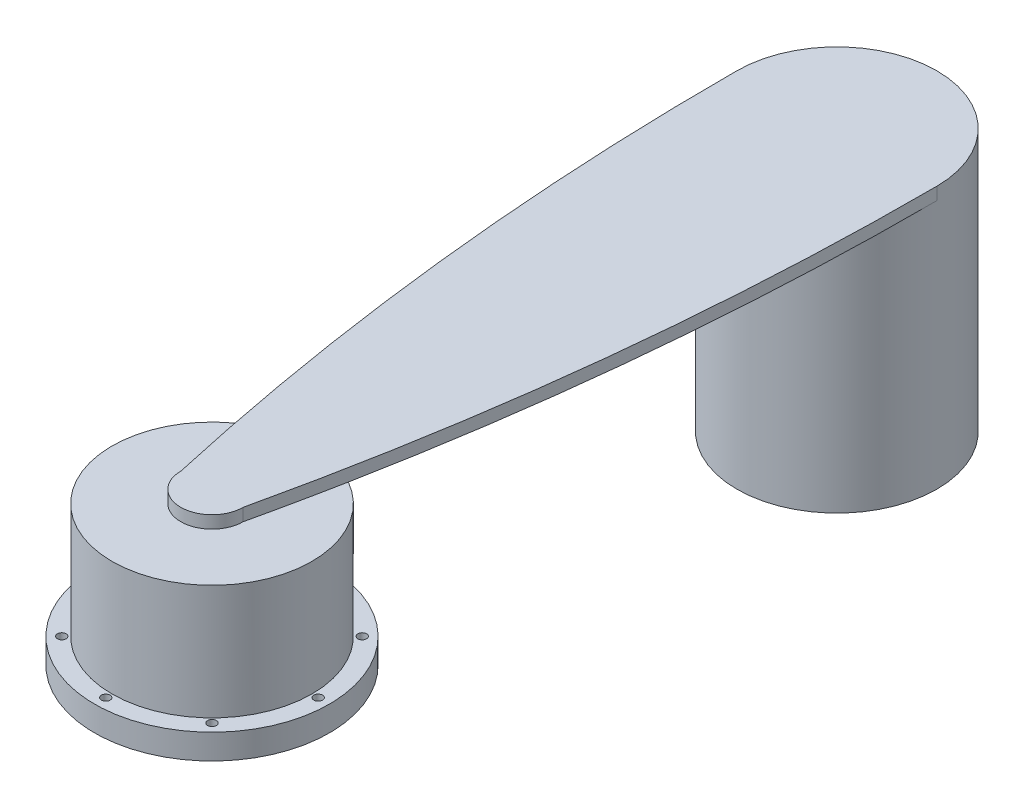
ISO-10303-21;
HEADER;
FILE_DESCRIPTION(('STEP AP214'),'2;1');
FILE_NAME('part.step','',(''),(''),'','','');
FILE_SCHEMA(('AUTOMOTIVE_DESIGN { 1 0 10303 214 1 1 1 1 }'));
ENDSEC;
DATA;
#1=APPLICATION_CONTEXT('core data for automotive mechanical design processes');
#2=APPLICATION_PROTOCOL_DEFINITION('international standard','automotive_design',2000,#1);
#3=PRODUCT_CONTEXT('',#1,'mechanical');
#4=PRODUCT('Part','Part','',(#3));
#5=PRODUCT_RELATED_PRODUCT_CATEGORY('part','',(#4));
#6=PRODUCT_DEFINITION_FORMATION('','',#4);
#7=PRODUCT_DEFINITION_CONTEXT('part definition',#1,'design');
#8=PRODUCT_DEFINITION('design','',#6,#7);
#9=PRODUCT_DEFINITION_SHAPE('','',#8);
#10=(LENGTH_UNIT() NAMED_UNIT(*) SI_UNIT(.MILLI.,.METRE.));
#11=(NAMED_UNIT(*) PLANE_ANGLE_UNIT() SI_UNIT($,.RADIAN.));
#12=(NAMED_UNIT(*) SI_UNIT($,.STERADIAN.) SOLID_ANGLE_UNIT());
#13=UNCERTAINTY_MEASURE_WITH_UNIT(LENGTH_MEASURE(1.E-05),#10,'distance_accuracy_value','');
#14=(GEOMETRIC_REPRESENTATION_CONTEXT(3) GLOBAL_UNCERTAINTY_ASSIGNED_CONTEXT((#13)) GLOBAL_UNIT_ASSIGNED_CONTEXT((#10,
#11,#12)) REPRESENTATION_CONTEXT('',''));
#15=CARTESIAN_POINT('',(0.,0.,0.));
#16=DIRECTION('',(0.,0.,1.));
#17=DIRECTION('',(1.,0.,0.));
#18=AXIS2_PLACEMENT_3D('',#15,#16,#17);
#19=CARTESIAN_POINT('',(0.,55.,-250.));
#20=DIRECTION('',(0.,-1.,0.));
#21=DIRECTION('',(0.,0.,-1.));
#22=AXIS2_PLACEMENT_3D('',#19,#20,#21);
#23=CYLINDRICAL_SURFACE('',#22,40.);
#24=CARTESIAN_POINT('',(0.,50.,-250.));
#25=DIRECTION('',(0.,1.,0.));
#26=DIRECTION('',(0.,0.,1.));
#27=AXIS2_PLACEMENT_3D('',#24,#25,#26);
#28=CIRCLE('',#27,40.);
#29=CARTESIAN_POINT('',(-40.,50.,-250.));
#30=VERTEX_POINT('',#29);
#31=CARTESIAN_POINT('',(40.,50.,-249.997784619593));
#32=VERTEX_POINT('',#31);
#33=EDGE_CURVE('E12',#30,#32,#28,.T.);
#34=ORIENTED_EDGE('',*,*,#33,.F.);
#35=DIRECTION('',(0.,1.,0.));
#36=VECTOR('',#35,1.);
#37=CARTESIAN_POINT('',(-40.0000000613489,50.,-250.));
#38=LINE('',#37,#36);
#39=CARTESIAN_POINT('',(-40.0000000613489,55.,-250.));
#40=VERTEX_POINT('',#39);
#41=EDGE_CURVE('E145',#30,#40,#38,.T.);
#42=ORIENTED_EDGE('',*,*,#41,.T.);
#43=CARTESIAN_POINT('',(0.,55.,-250.));
#44=DIRECTION('',(0.,1.,0.));
#45=DIRECTION('',(0.,0.,1.));
#46=AXIS2_PLACEMENT_3D('',#43,#44,#45);
#47=CIRCLE('',#46,40.0000000613489);
#48=CARTESIAN_POINT('',(40.0000000613489,55.,-250.));
#49=VERTEX_POINT('',#48);
#50=EDGE_CURVE('E142',#49,#40,#47,.T.);
#51=ORIENTED_EDGE('',*,*,#50,.F.);
#52=DIRECTION('',(0.,1.,0.));
#53=VECTOR('',#52,1.);
#54=CARTESIAN_POINT('',(40.0000000613489,50.,-250.));
#55=LINE('',#54,#53);
#56=CARTESIAN_POINT('',(40.0000000613489,50.,-250.));
#57=VERTEX_POINT('',#56);
#58=EDGE_CURVE('E147',#57,#49,#55,.T.);
#59=ORIENTED_EDGE('',*,*,#58,.F.);
#60=DIRECTION('',(0.,0.,-1.));
#61=VECTOR('',#60,1.);
#62=CARTESIAN_POINT('',(40.,50.,0.));
#63=LINE('',#62,#61);
#64=EDGE_CURVE('E58',#32,#57,#63,.T.);
#65=ORIENTED_EDGE('',*,*,#64,.F.);
#66=EDGE_LOOP('',(#34,#42,#51,#59,#65));
#67=FACE_BOUND('',#66,.T.);
#68=CARTESIAN_POINT('',(0.,-50.,-250.));
#69=DIRECTION('',(0.,-1.,0.));
#70=DIRECTION('',(0.,0.,-1.));
#71=AXIS2_PLACEMENT_3D('',#68,#69,#70);
#72=CIRCLE('',#71,39.9999999693256);
#73=CARTESIAN_POINT('',(0.,-50.,-289.999999969326));
#74=VERTEX_POINT('',#73);
#75=EDGE_CURVE('E119',#74,#74,#72,.T.);
#76=ORIENTED_EDGE('',*,*,#75,.F.);
#77=EDGE_LOOP('',(#76));
#78=FACE_BOUND('',#77,.T.);
#79=ADVANCED_FACE('F51',(#67,#78),#23,.T.);
#80=CARTESIAN_POINT('',(1080.43486466352,50.,-246.735335387937));
#81=DIRECTION('',(0.,1.,0.));
#82=DIRECTION('',(0.,0.,1.));
#83=AXIS2_PLACEMENT_3D('',#80,#81,#82);
#84=CYLINDRICAL_SURFACE('',#83,1120.43962091942);
#85=CARTESIAN_POINT('',(1080.43486466352,55.,-246.735335387937));
#86=DIRECTION('',(0.,1.,0.));
#87=DIRECTION('',(0.,0.,1.));
#88=AXIS2_PLACEMENT_3D('',#85,#86,#87);
#89=CIRCLE('',#88,1120.43962091942);
#90=CARTESIAN_POINT('',(-12.5,55.,0.));
#91=VERTEX_POINT('',#90);
#92=EDGE_CURVE('E132',#40,#91,#89,.T.);
#93=ORIENTED_EDGE('',*,*,#92,.F.);
#94=ORIENTED_EDGE('',*,*,#41,.F.);
#95=CARTESIAN_POINT('',(1080.43486466352,50.,-246.735335387937));
#96=DIRECTION('',(0.,1.,0.));
#97=DIRECTION('',(0.,0.,1.));
#98=AXIS2_PLACEMENT_3D('',#95,#96,#97);
#99=CIRCLE('',#98,1120.43962091942);
#100=CARTESIAN_POINT('',(-19.7724904494712,50.,-34.7713764672247));
#101=VERTEX_POINT('',#100);
#102=EDGE_CURVE('E129',#30,#101,#99,.T.);
#103=ORIENTED_EDGE('',*,*,#102,.T.);
#104=CARTESIAN_POINT('',(-12.5,50.,0.));
#105=VERTEX_POINT('',#104);
#106=EDGE_CURVE('E117',#101,#105,#99,.T.);
#107=ORIENTED_EDGE('',*,*,#106,.T.);
#108=DIRECTION('',(0.,1.,0.));
#109=VECTOR('',#108,1.);
#110=CARTESIAN_POINT('',(-12.5,50.,0.));
#111=LINE('',#110,#109);
#112=EDGE_CURVE('E109',#105,#91,#111,.T.);
#113=ORIENTED_EDGE('',*,*,#112,.T.);
#114=EDGE_LOOP('',(#93,#94,#103,#107,#113));
#115=FACE_BOUND('',#114,.T.);
#116=ADVANCED_FACE('F161',(#115),#84,.T.);
#117=CARTESIAN_POINT('',(-1080.43486466352,50.,-246.735335387937));
#118=DIRECTION('',(0.,1.,0.));
#119=DIRECTION('',(0.,0.,1.));
#120=AXIS2_PLACEMENT_3D('',#117,#118,#119);
#121=CYLINDRICAL_SURFACE('',#120,1120.43962091942);
#122=CARTESIAN_POINT('',(-1080.43486466352,55.,-246.735335387937));
#123=DIRECTION('',(0.,1.,0.));
#124=DIRECTION('',(0.,0.,-1.));
#125=AXIS2_PLACEMENT_3D('',#122,#123,#124);
#126=CIRCLE('',#125,1120.43962091942);
#127=CARTESIAN_POINT('',(12.5,55.,1.38777878078145E-13));
#128=VERTEX_POINT('',#127);
#129=EDGE_CURVE('E139',#128,#49,#126,.T.);
#130=ORIENTED_EDGE('',*,*,#129,.F.);
#131=DIRECTION('',(0.,1.,0.));
#132=VECTOR('',#131,1.);
#133=CARTESIAN_POINT('',(12.5,50.,1.38777878078145E-13));
#134=LINE('',#133,#132);
#135=CARTESIAN_POINT('',(12.5,50.,1.38777878078145E-13));
#136=VERTEX_POINT('',#135);
#137=EDGE_CURVE('E104',#136,#128,#134,.T.);
#138=ORIENTED_EDGE('',*,*,#137,.F.);
#139=CARTESIAN_POINT('',(-1080.43486466352,50.,-246.735335387937));
#140=DIRECTION('',(0.,1.,0.));
#141=DIRECTION('',(0.,0.,-1.));
#142=AXIS2_PLACEMENT_3D('',#139,#140,#141);
#143=CIRCLE('',#142,1120.43962091942);
#144=CARTESIAN_POINT('',(19.7724904494718,50.,-34.7713764672258));
#145=VERTEX_POINT('',#144);
#146=EDGE_CURVE('E100',#136,#145,#143,.T.);
#147=ORIENTED_EDGE('',*,*,#146,.T.);
#148=EDGE_CURVE('E103',#145,#32,#143,.T.);
#149=ORIENTED_EDGE('',*,*,#148,.T.);
#150=ORIENTED_EDGE('',*,*,#64,.T.);
#151=ORIENTED_EDGE('',*,*,#58,.T.);
#152=EDGE_LOOP('',(#130,#138,#147,#149,#150,#151));
#153=FACE_BOUND('',#152,.T.);
#154=ADVANCED_FACE('F102',(#153),#121,.T.);
#155=CARTESIAN_POINT('',(0.,50.,0.));
#156=DIRECTION('',(0.,1.,0.));
#157=DIRECTION('',(0.,0.,1.));
#158=AXIS2_PLACEMENT_3D('',#155,#156,#157);
#159=CYLINDRICAL_SURFACE('',#158,12.5);
#160=CARTESIAN_POINT('',(0.,55.,0.));
#161=DIRECTION('',(0.,1.,0.));
#162=DIRECTION('',(0.,0.,1.));
#163=AXIS2_PLACEMENT_3D('',#160,#161,#162);
#164=CIRCLE('',#163,12.5);
#165=EDGE_CURVE('E135',#91,#128,#164,.T.);
#166=ORIENTED_EDGE('',*,*,#165,.F.);
#167=ORIENTED_EDGE('',*,*,#112,.F.);
#168=CARTESIAN_POINT('',(0.,50.,0.));
#169=DIRECTION('',(0.,1.,0.));
#170=DIRECTION('',(0.,0.,1.));
#171=AXIS2_PLACEMENT_3D('',#168,#169,#170);
#172=CIRCLE('',#171,12.5);
#173=EDGE_CURVE('E112',#105,#136,#172,.T.);
#174=ORIENTED_EDGE('',*,*,#173,.T.);
#175=ORIENTED_EDGE('',*,*,#137,.T.);
#176=EDGE_LOOP('',(#166,#167,#174,#175));
#177=FACE_BOUND('',#176,.T.);
#178=ADVANCED_FACE('F159',(#177),#159,.T.);
#179=CARTESIAN_POINT('',(540.217432331759,50.,-123.367667693968));
#180=DIRECTION('',(0.,1.,0.));
#181=DIRECTION('',(0.,0.,1.));
#182=AXIS2_PLACEMENT_3D('',#179,#180,#181);
#183=PLANE('',#182);
#184=CARTESIAN_POINT('',(0.,50.,0.));
#185=DIRECTION('',(0.,1.,0.));
#186=DIRECTION('',(0.,0.,1.));
#187=AXIS2_PLACEMENT_3D('',#184,#185,#186);
#188=CIRCLE('',#187,40.);
#189=EDGE_CURVE('E65',#145,#101,#188,.T.);
#190=ORIENTED_EDGE('',*,*,#189,.T.);
#191=ORIENTED_EDGE('',*,*,#102,.F.);
#192=ORIENTED_EDGE('',*,*,#33,.T.);
#193=ORIENTED_EDGE('',*,*,#148,.F.);
#194=EDGE_LOOP('',(#190,#191,#192,#193));
#195=FACE_BOUND('',#194,.T.);
#196=ADVANCED_FACE('F111',(#195),#183,.F.);
#197=CARTESIAN_POINT('',(540.217432331759,55.,-123.367667693968));
#198=DIRECTION('',(0.,1.,0.));
#199=DIRECTION('',(0.,0.,1.));
#200=AXIS2_PLACEMENT_3D('',#197,#198,#199);
#201=PLANE('',#200);
#202=ORIENTED_EDGE('',*,*,#92,.T.);
#203=ORIENTED_EDGE('',*,*,#165,.T.);
#204=ORIENTED_EDGE('',*,*,#129,.T.);
#205=ORIENTED_EDGE('',*,*,#50,.T.);
#206=EDGE_LOOP('',(#202,#203,#204,#205));
#207=FACE_BOUND('',#206,.T.);
#208=ADVANCED_FACE('F155',(#207),#201,.T.);
#209=CARTESIAN_POINT('',(0.,50.,0.));
#210=DIRECTION('',(0.,-1.,0.));
#211=DIRECTION('',(0.,0.,-1.));
#212=AXIS2_PLACEMENT_3D('',#209,#210,#211);
#213=CYLINDRICAL_SURFACE('',#212,40.);
#214=CARTESIAN_POINT('',(0.,4.04999999999999,0.));
#215=DIRECTION('',(0.,-1.,0.));
#216=DIRECTION('',(0.,0.,-1.));
#217=AXIS2_PLACEMENT_3D('',#214,#215,#216);
#218=CIRCLE('',#217,40.);
#219=CARTESIAN_POINT('',(0.,4.04999999999999,-40.));
#220=VERTEX_POINT('',#219);
#221=EDGE_CURVE('E128',#220,#220,#218,.T.);
#222=ORIENTED_EDGE('',*,*,#221,.F.);
#223=EDGE_LOOP('',(#222));
#224=FACE_BOUND('',#223,.T.);
#225=ORIENTED_EDGE('',*,*,#189,.F.);
#226=EDGE_CURVE('E115',#101,#145,#188,.T.);
#227=ORIENTED_EDGE('',*,*,#226,.F.);
#228=EDGE_LOOP('',(#225,#227));
#229=FACE_BOUND('',#228,.T.);
#230=ADVANCED_FACE('F121',(#224,#229),#213,.T.);
#231=CARTESIAN_POINT('',(0.,50.,0.));
#232=DIRECTION('',(0.,1.,0.));
#233=DIRECTION('',(0.,0.,1.));
#234=AXIS2_PLACEMENT_3D('',#231,#232,#233);
#235=PLANE('',#234);
#236=ORIENTED_EDGE('',*,*,#173,.F.);
#237=ORIENTED_EDGE('',*,*,#106,.F.);
#238=ORIENTED_EDGE('',*,*,#226,.T.);
#239=ORIENTED_EDGE('',*,*,#146,.F.);
#240=EDGE_LOOP('',(#236,#237,#238,#239));
#241=FACE_BOUND('',#240,.T.);
#242=ADVANCED_FACE('F116',(#241),#235,.T.);
#243=CARTESIAN_POINT('',(0.,-5.95000000000001,0.));
#244=DIRECTION('',(0.,1.,0.));
#245=DIRECTION('',(0.,0.,1.));
#246=AXIS2_PLACEMENT_3D('',#243,#244,#245);
#247=CYLINDRICAL_SURFACE('',#246,47.);
#248=CARTESIAN_POINT('',(0.,-5.95000000000001,0.));
#249=DIRECTION('',(0.,-1.,0.));
#250=DIRECTION('',(0.,0.,-1.));
#251=AXIS2_PLACEMENT_3D('',#248,#249,#250);
#252=CIRCLE('',#251,47.);
#253=CARTESIAN_POINT('',(0.,-5.95000000000001,-47.));
#254=VERTEX_POINT('',#253);
#255=EDGE_CURVE('E124',#254,#254,#252,.T.);
#256=ORIENTED_EDGE('',*,*,#255,.F.);
#257=EDGE_LOOP('',(#256));
#258=FACE_BOUND('',#257,.T.);
#259=CARTESIAN_POINT('',(0.,4.04999999999999,0.));
#260=DIRECTION('',(0.,-1.,0.));
#261=DIRECTION('',(0.,0.,-1.));
#262=AXIS2_PLACEMENT_3D('',#259,#260,#261);
#263=CIRCLE('',#262,47.);
#264=CARTESIAN_POINT('',(0.,4.04999999999999,-47.));
#265=VERTEX_POINT('',#264);
#266=EDGE_CURVE('E122',#265,#265,#263,.T.);
#267=ORIENTED_EDGE('',*,*,#266,.T.);
#268=EDGE_LOOP('',(#267));
#269=FACE_BOUND('',#268,.T.);
#270=ADVANCED_FACE('F253',(#258,#269),#247,.T.);
#271=CARTESIAN_POINT('',(0.,-5.95000000000001,0.));
#272=DIRECTION('',(0.,-1.,0.));
#273=DIRECTION('',(0.,0.,-1.));
#274=AXIS2_PLACEMENT_3D('',#271,#272,#273);
#275=PLANE('',#274);
#276=CARTESIAN_POINT('',(42.5,-5.95000000000001,0.));
#277=DIRECTION('',(0.,-1.,0.));
#278=DIRECTION('',(0.,0.,-1.));
#279=AXIS2_PLACEMENT_3D('',#276,#277,#278);
#280=CIRCLE('',#279,1.75);
#281=CARTESIAN_POINT('',(42.5,-5.95000000000001,-1.75));
#282=VERTEX_POINT('',#281);
#283=EDGE_CURVE('E191',#282,#282,#280,.T.);
#284=ORIENTED_EDGE('',*,*,#283,.F.);
#285=EDGE_LOOP('',(#284));
#286=FACE_BOUND('',#285,.T.);
#287=CARTESIAN_POINT('',(30.0520382004282,-5.95000000000001,-30.0520382004283));
#288=DIRECTION('',(0.,-1.,0.));
#289=DIRECTION('',(0.,0.,-1.));
#290=AXIS2_PLACEMENT_3D('',#287,#288,#289);
#291=CIRCLE('',#290,1.75);
#292=CARTESIAN_POINT('',(30.0520382004282,-5.95000000000001,-31.8020382004283));
#293=VERTEX_POINT('',#292);
#294=EDGE_CURVE('E199',#293,#293,#291,.T.);
#295=ORIENTED_EDGE('',*,*,#294,.F.);
#296=EDGE_LOOP('',(#295));
#297=FACE_BOUND('',#296,.T.);
#298=CARTESIAN_POINT('',(-1.48387956900833E-13,-5.95000000000001,-42.5));
#299=DIRECTION('',(0.,-1.,0.));
#300=DIRECTION('',(0.,0.,-1.));
#301=AXIS2_PLACEMENT_3D('',#298,#299,#300);
#302=CIRCLE('',#301,1.75);
#303=CARTESIAN_POINT('',(-1.48387956900833E-13,-5.95000000000001,-44.25));
#304=VERTEX_POINT('',#303);
#305=EDGE_CURVE('E205',#304,#304,#302,.T.);
#306=ORIENTED_EDGE('',*,*,#305,.F.);
#307=EDGE_LOOP('',(#306));
#308=FACE_BOUND('',#307,.T.);
#309=CARTESIAN_POINT('',(-30.0520382004284,-5.95000000000001,-30.0520382004281));
#310=DIRECTION('',(0.,-1.,0.));
#311=DIRECTION('',(0.,0.,-1.));
#312=AXIS2_PLACEMENT_3D('',#309,#310,#311);
#313=CIRCLE('',#312,1.75);
#314=CARTESIAN_POINT('',(-30.0520382004284,-5.95000000000001,-31.8020382004281));
#315=VERTEX_POINT('',#314);
#316=EDGE_CURVE('E211',#315,#315,#313,.T.);
#317=ORIENTED_EDGE('',*,*,#316,.F.);
#318=EDGE_LOOP('',(#317));
#319=FACE_BOUND('',#318,.T.);
#320=CARTESIAN_POINT('',(-42.5,-5.95000000000001,2.96775913801666E-13));
#321=DIRECTION('',(0.,-1.,0.));
#322=DIRECTION('',(0.,0.,-1.));
#323=AXIS2_PLACEMENT_3D('',#320,#321,#322);
#324=CIRCLE('',#323,1.75000000000001);
#325=CARTESIAN_POINT('',(-42.5,-5.95000000000001,-1.74999999999971));
#326=VERTEX_POINT('',#325);
#327=EDGE_CURVE('E217',#326,#326,#324,.T.);
#328=ORIENTED_EDGE('',*,*,#327,.F.);
#329=EDGE_LOOP('',(#328));
#330=FACE_BOUND('',#329,.T.);
#331=CARTESIAN_POINT('',(-30.052038200428,-5.95000000000001,30.0520382004285));
#332=DIRECTION('',(0.,-1.,0.));
#333=DIRECTION('',(0.,0.,-1.));
#334=AXIS2_PLACEMENT_3D('',#331,#332,#333);
#335=CIRCLE('',#334,1.75);
#336=CARTESIAN_POINT('',(-30.052038200428,-5.95000000000001,28.3020382004285));
#337=VERTEX_POINT('',#336);
#338=EDGE_CURVE('E223',#337,#337,#335,.T.);
#339=ORIENTED_EDGE('',*,*,#338,.F.);
#340=EDGE_LOOP('',(#339));
#341=FACE_BOUND('',#340,.T.);
#342=CARTESIAN_POINT('',(4.451638707025E-13,-5.95000000000001,42.5));
#343=DIRECTION('',(0.,-1.,0.));
#344=DIRECTION('',(0.,0.,-1.));
#345=AXIS2_PLACEMENT_3D('',#342,#343,#344);
#346=CIRCLE('',#345,1.75000000000001);
#347=CARTESIAN_POINT('',(4.451638707025E-13,-5.95000000000001,40.75));
#348=VERTEX_POINT('',#347);
#349=EDGE_CURVE('E229',#348,#348,#346,.T.);
#350=ORIENTED_EDGE('',*,*,#349,.F.);
#351=EDGE_LOOP('',(#350));
#352=FACE_BOUND('',#351,.T.);
#353=CARTESIAN_POINT('',(30.0520382004286,-5.95000000000001,30.0520382004279));
#354=DIRECTION('',(0.,-1.,0.));
#355=DIRECTION('',(0.,0.,-1.));
#356=AXIS2_PLACEMENT_3D('',#353,#354,#355);
#357=CIRCLE('',#356,1.75);
#358=CARTESIAN_POINT('',(30.0520382004286,-5.95000000000001,28.3020382004279));
#359=VERTEX_POINT('',#358);
#360=EDGE_CURVE('E235',#359,#359,#357,.T.);
#361=ORIENTED_EDGE('',*,*,#360,.F.);
#362=EDGE_LOOP('',(#361));
#363=FACE_BOUND('',#362,.T.);
#364=ORIENTED_EDGE('',*,*,#255,.T.);
#365=EDGE_LOOP('',(#364));
#366=FACE_BOUND('',#365,.T.);
#367=ADVANCED_FACE('F290',(#286,#297,#308,#319,#330,#341,#352,#363,#366),#275,.T.);
#368=CARTESIAN_POINT('',(0.,4.04999999999999,0.));
#369=DIRECTION('',(0.,-1.,0.));
#370=DIRECTION('',(0.,0.,-1.));
#371=AXIS2_PLACEMENT_3D('',#368,#369,#370);
#372=PLANE('',#371);
#373=CARTESIAN_POINT('',(42.5,4.04999999999999,0.));
#374=DIRECTION('',(0.,-1.,0.));
#375=DIRECTION('',(0.,0.,-1.));
#376=AXIS2_PLACEMENT_3D('',#373,#374,#375);
#377=CIRCLE('',#376,1.75);
#378=CARTESIAN_POINT('',(42.5,4.04999999999999,-1.75));
#379=VERTEX_POINT('',#378);
#380=EDGE_CURVE('E136',#379,#379,#377,.F.);
#381=ORIENTED_EDGE('',*,*,#380,.F.);
#382=EDGE_LOOP('',(#381));
#383=FACE_BOUND('',#382,.T.);
#384=CARTESIAN_POINT('',(30.0520382004282,4.04999999999999,-30.0520382004283));
#385=DIRECTION('',(0.,-1.,0.));
#386=DIRECTION('',(0.,0.,-1.));
#387=AXIS2_PLACEMENT_3D('',#384,#385,#386);
#388=CIRCLE('',#387,1.75);
#389=CARTESIAN_POINT('',(30.0520382004282,4.04999999999999,-31.8020382004283));
#390=VERTEX_POINT('',#389);
#391=EDGE_CURVE('E194',#390,#390,#388,.F.);
#392=ORIENTED_EDGE('',*,*,#391,.F.);
#393=EDGE_LOOP('',(#392));
#394=FACE_BOUND('',#393,.T.);
#395=CARTESIAN_POINT('',(-1.48387956900833E-13,4.04999999999999,-42.5));
#396=DIRECTION('',(0.,-1.,0.));
#397=DIRECTION('',(0.,0.,-1.));
#398=AXIS2_PLACEMENT_3D('',#395,#396,#397);
#399=CIRCLE('',#398,1.75);
#400=CARTESIAN_POINT('',(-1.48387956900833E-13,4.04999999999999,-44.25));
#401=VERTEX_POINT('',#400);
#402=EDGE_CURVE('E202',#401,#401,#399,.F.);
#403=ORIENTED_EDGE('',*,*,#402,.F.);
#404=EDGE_LOOP('',(#403));
#405=FACE_BOUND('',#404,.T.);
#406=CARTESIAN_POINT('',(-30.0520382004284,4.04999999999999,-30.0520382004281));
#407=DIRECTION('',(0.,-1.,0.));
#408=DIRECTION('',(0.,0.,-1.));
#409=AXIS2_PLACEMENT_3D('',#406,#407,#408);
#410=CIRCLE('',#409,1.75);
#411=CARTESIAN_POINT('',(-30.0520382004284,4.04999999999999,-31.8020382004281));
#412=VERTEX_POINT('',#411);
#413=EDGE_CURVE('E208',#412,#412,#410,.F.);
#414=ORIENTED_EDGE('',*,*,#413,.F.);
#415=EDGE_LOOP('',(#414));
#416=FACE_BOUND('',#415,.T.);
#417=CARTESIAN_POINT('',(-42.5,4.04999999999999,2.96775913801666E-13));
#418=DIRECTION('',(0.,-1.,0.));
#419=DIRECTION('',(0.,0.,-1.));
#420=AXIS2_PLACEMENT_3D('',#417,#418,#419);
#421=CIRCLE('',#420,1.75000000000001);
#422=CARTESIAN_POINT('',(-42.5,4.04999999999999,-1.74999999999971));
#423=VERTEX_POINT('',#422);
#424=EDGE_CURVE('E214',#423,#423,#421,.F.);
#425=ORIENTED_EDGE('',*,*,#424,.F.);
#426=EDGE_LOOP('',(#425));
#427=FACE_BOUND('',#426,.T.);
#428=CARTESIAN_POINT('',(-30.052038200428,4.04999999999999,30.0520382004285));
#429=DIRECTION('',(0.,-1.,0.));
#430=DIRECTION('',(0.,0.,-1.));
#431=AXIS2_PLACEMENT_3D('',#428,#429,#430);
#432=CIRCLE('',#431,1.75);
#433=CARTESIAN_POINT('',(-30.052038200428,4.04999999999999,28.3020382004285));
#434=VERTEX_POINT('',#433);
#435=EDGE_CURVE('E220',#434,#434,#432,.F.);
#436=ORIENTED_EDGE('',*,*,#435,.F.);
#437=EDGE_LOOP('',(#436));
#438=FACE_BOUND('',#437,.T.);
#439=CARTESIAN_POINT('',(4.451638707025E-13,4.04999999999999,42.5));
#440=DIRECTION('',(0.,-1.,0.));
#441=DIRECTION('',(0.,0.,-1.));
#442=AXIS2_PLACEMENT_3D('',#439,#440,#441);
#443=CIRCLE('',#442,1.75000000000001);
#444=CARTESIAN_POINT('',(4.451638707025E-13,4.04999999999999,40.75));
#445=VERTEX_POINT('',#444);
#446=EDGE_CURVE('E226',#445,#445,#443,.F.);
#447=ORIENTED_EDGE('',*,*,#446,.F.);
#448=EDGE_LOOP('',(#447));
#449=FACE_BOUND('',#448,.T.);
#450=CARTESIAN_POINT('',(30.0520382004286,4.04999999999999,30.0520382004279));
#451=DIRECTION('',(0.,-1.,0.));
#452=DIRECTION('',(0.,0.,-1.));
#453=AXIS2_PLACEMENT_3D('',#450,#451,#452);
#454=CIRCLE('',#453,1.75);
#455=CARTESIAN_POINT('',(30.0520382004286,4.04999999999999,28.3020382004279));
#456=VERTEX_POINT('',#455);
#457=EDGE_CURVE('E232',#456,#456,#454,.F.);
#458=ORIENTED_EDGE('',*,*,#457,.F.);
#459=EDGE_LOOP('',(#458));
#460=FACE_BOUND('',#459,.T.);
#461=ORIENTED_EDGE('',*,*,#221,.T.);
#462=EDGE_LOOP('',(#461));
#463=FACE_BOUND('',#462,.T.);
#464=ORIENTED_EDGE('',*,*,#266,.F.);
#465=EDGE_LOOP('',(#464));
#466=FACE_BOUND('',#465,.T.);
#467=ADVANCED_FACE('F244',(#383,#394,#405,#416,#427,#438,#449,#460,#463,#466),#372,.F.);
#468=CARTESIAN_POINT('',(30.0520382004286,55.001,30.0520382004279));
#469=DIRECTION('',(0.,-1.,0.));
#470=DIRECTION('',(0.,0.,-1.));
#471=AXIS2_PLACEMENT_3D('',#468,#469,#470);
#472=CYLINDRICAL_SURFACE('',#471,1.75);
#473=ORIENTED_EDGE('',*,*,#360,.T.);
#474=EDGE_LOOP('',(#473));
#475=FACE_BOUND('',#474,.T.);
#476=ORIENTED_EDGE('',*,*,#457,.T.);
#477=EDGE_LOOP('',(#476));
#478=FACE_BOUND('',#477,.T.);
#479=ADVANCED_FACE('F285',(#475,#478),#472,.F.);
#480=CARTESIAN_POINT('',(4.451638707025E-13,55.001,42.5));
#481=DIRECTION('',(0.,-1.,0.));
#482=DIRECTION('',(0.,0.,-1.));
#483=AXIS2_PLACEMENT_3D('',#480,#481,#482);
#484=CYLINDRICAL_SURFACE('',#483,1.75000000000001);
#485=ORIENTED_EDGE('',*,*,#349,.T.);
#486=EDGE_LOOP('',(#485));
#487=FACE_BOUND('',#486,.T.);
#488=ORIENTED_EDGE('',*,*,#446,.T.);
#489=EDGE_LOOP('',(#488));
#490=FACE_BOUND('',#489,.T.);
#491=ADVANCED_FACE('F281',(#487,#490),#484,.F.);
#492=CARTESIAN_POINT('',(-30.052038200428,55.001,30.0520382004285));
#493=DIRECTION('',(0.,-1.,0.));
#494=DIRECTION('',(0.,0.,-1.));
#495=AXIS2_PLACEMENT_3D('',#492,#493,#494);
#496=CYLINDRICAL_SURFACE('',#495,1.75);
#497=ORIENTED_EDGE('',*,*,#338,.T.);
#498=EDGE_LOOP('',(#497));
#499=FACE_BOUND('',#498,.T.);
#500=ORIENTED_EDGE('',*,*,#435,.T.);
#501=EDGE_LOOP('',(#500));
#502=FACE_BOUND('',#501,.T.);
#503=ADVANCED_FACE('F277',(#499,#502),#496,.F.);
#504=CARTESIAN_POINT('',(-42.5,55.001,2.96775913801666E-13));
#505=DIRECTION('',(0.,-1.,0.));
#506=DIRECTION('',(0.,0.,-1.));
#507=AXIS2_PLACEMENT_3D('',#504,#505,#506);
#508=CYLINDRICAL_SURFACE('',#507,1.75000000000001);
#509=ORIENTED_EDGE('',*,*,#327,.T.);
#510=EDGE_LOOP('',(#509));
#511=FACE_BOUND('',#510,.T.);
#512=ORIENTED_EDGE('',*,*,#424,.T.);
#513=EDGE_LOOP('',(#512));
#514=FACE_BOUND('',#513,.T.);
#515=ADVANCED_FACE('F273',(#511,#514),#508,.F.);
#516=CARTESIAN_POINT('',(-30.0520382004284,55.001,-30.0520382004281));
#517=DIRECTION('',(0.,-1.,0.));
#518=DIRECTION('',(0.,0.,-1.));
#519=AXIS2_PLACEMENT_3D('',#516,#517,#518);
#520=CYLINDRICAL_SURFACE('',#519,1.75);
#521=ORIENTED_EDGE('',*,*,#316,.T.);
#522=EDGE_LOOP('',(#521));
#523=FACE_BOUND('',#522,.T.);
#524=ORIENTED_EDGE('',*,*,#413,.T.);
#525=EDGE_LOOP('',(#524));
#526=FACE_BOUND('',#525,.T.);
#527=ADVANCED_FACE('F269',(#523,#526),#520,.F.);
#528=CARTESIAN_POINT('',(-1.48387956900833E-13,55.001,-42.5));
#529=DIRECTION('',(0.,-1.,0.));
#530=DIRECTION('',(0.,0.,-1.));
#531=AXIS2_PLACEMENT_3D('',#528,#529,#530);
#532=CYLINDRICAL_SURFACE('',#531,1.75);
#533=ORIENTED_EDGE('',*,*,#305,.T.);
#534=EDGE_LOOP('',(#533));
#535=FACE_BOUND('',#534,.T.);
#536=ORIENTED_EDGE('',*,*,#402,.T.);
#537=EDGE_LOOP('',(#536));
#538=FACE_BOUND('',#537,.T.);
#539=ADVANCED_FACE('F265',(#535,#538),#532,.F.);
#540=CARTESIAN_POINT('',(30.0520382004282,55.001,-30.0520382004283));
#541=DIRECTION('',(0.,-1.,0.));
#542=DIRECTION('',(0.,0.,-1.));
#543=AXIS2_PLACEMENT_3D('',#540,#541,#542);
#544=CYLINDRICAL_SURFACE('',#543,1.75);
#545=ORIENTED_EDGE('',*,*,#294,.T.);
#546=EDGE_LOOP('',(#545));
#547=FACE_BOUND('',#546,.T.);
#548=ORIENTED_EDGE('',*,*,#391,.T.);
#549=EDGE_LOOP('',(#548));
#550=FACE_BOUND('',#549,.T.);
#551=ADVANCED_FACE('F261',(#547,#550),#544,.F.);
#552=CARTESIAN_POINT('',(42.5,55.001,0.));
#553=DIRECTION('',(0.,-1.,0.));
#554=DIRECTION('',(0.,0.,-1.));
#555=AXIS2_PLACEMENT_3D('',#552,#553,#554);
#556=CYLINDRICAL_SURFACE('',#555,1.75);
#557=ORIENTED_EDGE('',*,*,#283,.T.);
#558=EDGE_LOOP('',(#557));
#559=FACE_BOUND('',#558,.T.);
#560=ORIENTED_EDGE('',*,*,#380,.T.);
#561=EDGE_LOOP('',(#560));
#562=FACE_BOUND('',#561,.T.);
#563=ADVANCED_FACE('F258',(#559,#562),#556,.F.);
#564=CARTESIAN_POINT('',(0.,-50.,-250.));
#565=DIRECTION('',(0.,-1.,0.));
#566=DIRECTION('',(0.,0.,-1.));
#567=AXIS2_PLACEMENT_3D('',#564,#565,#566);
#568=PLANE('',#567);
#569=ORIENTED_EDGE('',*,*,#75,.T.);
#570=EDGE_LOOP('',(#569));
#571=FACE_BOUND('',#570,.T.);
#572=CARTESIAN_POINT('',(0.,-50.,-250.));
#573=DIRECTION('',(0.,-1.,0.));
#574=DIRECTION('',(1.,0.,0.));
#575=AXIS2_PLACEMENT_3D('',#572,#573,#574);
#576=CIRCLE('',#575,29.9999999693256);
#577=CARTESIAN_POINT('',(29.9999999693256,-50.,-250.));
#578=VERTEX_POINT('',#577);
#579=EDGE_CURVE('E184',#578,#578,#576,.T.);
#580=ORIENTED_EDGE('',*,*,#579,.F.);
#581=EDGE_LOOP('',(#580));
#582=FACE_BOUND('',#581,.T.);
#583=ADVANCED_FACE('F177',(#571,#582),#568,.T.);
#584=CARTESIAN_POINT('',(0.,-50.,-250.));
#585=DIRECTION('',(0.,1.,0.));
#586=DIRECTION('',(0.,0.,1.));
#587=AXIS2_PLACEMENT_3D('',#584,#585,#586);
#588=CYLINDRICAL_SURFACE('',#587,29.9999999693256);
#589=ORIENTED_EDGE('',*,*,#579,.T.);
#590=EDGE_LOOP('',(#589));
#591=FACE_BOUND('',#590,.T.);
#592=CARTESIAN_POINT('',(0.,-25.,-250.));
#593=DIRECTION('',(0.,-1.,0.));
#594=DIRECTION('',(1.,0.,0.));
#595=AXIS2_PLACEMENT_3D('',#592,#593,#594);
#596=CIRCLE('',#595,29.9999999693256);
#597=CARTESIAN_POINT('',(29.9999999693256,-25.,-250.));
#598=VERTEX_POINT('',#597);
#599=EDGE_CURVE('E182',#598,#598,#596,.T.);
#600=ORIENTED_EDGE('',*,*,#599,.F.);
#601=EDGE_LOOP('',(#600));
#602=FACE_BOUND('',#601,.T.);
#603=ADVANCED_FACE('F172',(#591,#602),#588,.F.);
#604=CARTESIAN_POINT('',(0.,-25.,-250.));
#605=DIRECTION('',(0.,1.,0.));
#606=DIRECTION('',(0.,0.,1.));
#607=AXIS2_PLACEMENT_3D('',#604,#605,#606);
#608=PLANE('',#607);
#609=ORIENTED_EDGE('',*,*,#599,.T.);
#610=EDGE_LOOP('',(#609));
#611=FACE_BOUND('',#610,.T.);
#612=ADVANCED_FACE('F170',(#611),#608,.F.);
#613=CLOSED_SHELL('',(#79,#116,#154,#178,#196,#208,#230,#242,#270,#367,#467,#479,#491,#503,#515,
#527,#539,#551,#563,#583,#603,#612));
#614=MANIFOLD_SOLID_BREP('B2',#613);
#615=ADVANCED_BREP_SHAPE_REPRESENTATION('',(#18,#614),#14);
#616=SHAPE_DEFINITION_REPRESENTATION(#9,#615);
ENDSEC;
END-ISO-10303-21;
